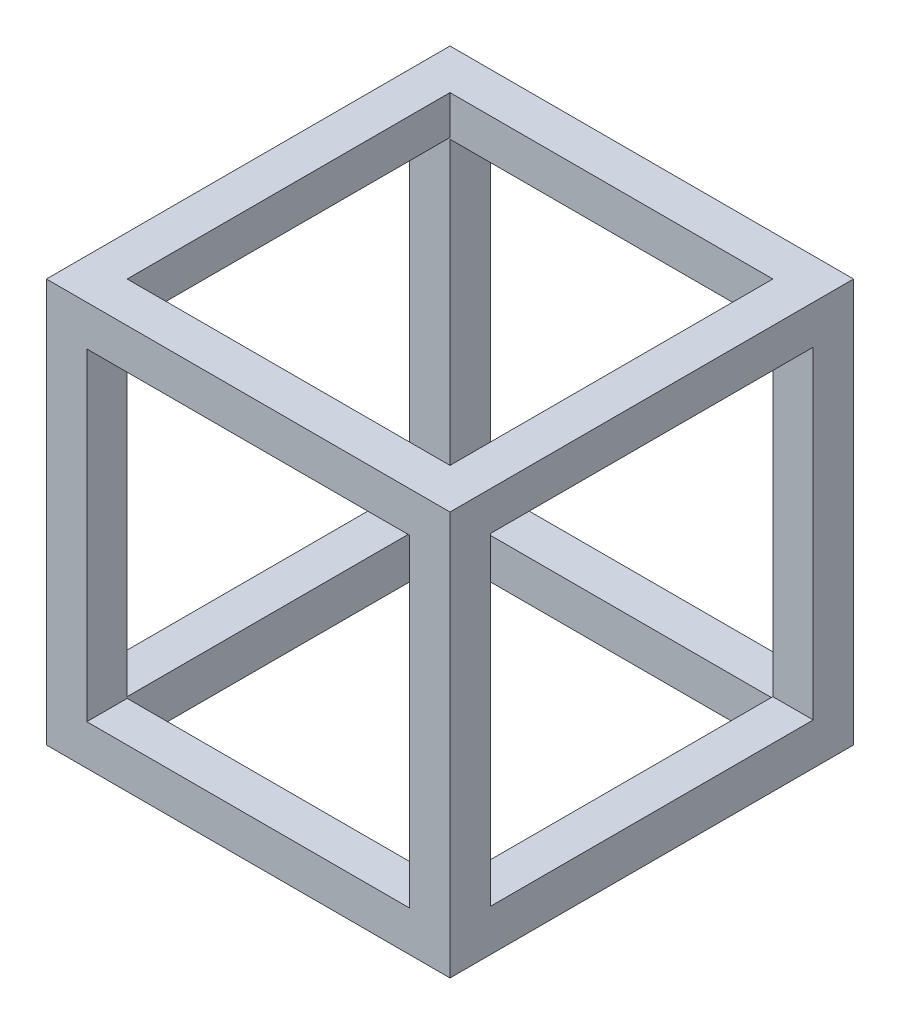
ISO-10303-21;
HEADER;
FILE_DESCRIPTION(('STEP AP214'),'2;1');
FILE_NAME('part.step','',(''),(''),'','','');
FILE_SCHEMA(('AUTOMOTIVE_DESIGN { 1 0 10303 214 1 1 1 1 }'));
ENDSEC;
DATA;
#1=APPLICATION_CONTEXT('core data for automotive mechanical design processes');
#2=APPLICATION_PROTOCOL_DEFINITION('international standard','automotive_design',2000,#1);
#3=PRODUCT_CONTEXT('',#1,'mechanical');
#4=PRODUCT('Part','Part','',(#3));
#5=PRODUCT_RELATED_PRODUCT_CATEGORY('part','',(#4));
#6=PRODUCT_DEFINITION_FORMATION('','',#4);
#7=PRODUCT_DEFINITION_CONTEXT('part definition',#1,'design');
#8=PRODUCT_DEFINITION('design','',#6,#7);
#9=PRODUCT_DEFINITION_SHAPE('','',#8);
#10=(LENGTH_UNIT() NAMED_UNIT(*) SI_UNIT(.MILLI.,.METRE.));
#11=(NAMED_UNIT(*) PLANE_ANGLE_UNIT() SI_UNIT($,.RADIAN.));
#12=(NAMED_UNIT(*) SI_UNIT($,.STERADIAN.) SOLID_ANGLE_UNIT());
#13=UNCERTAINTY_MEASURE_WITH_UNIT(LENGTH_MEASURE(1.E-05),#10,'distance_accuracy_value','');
#14=(GEOMETRIC_REPRESENTATION_CONTEXT(3) GLOBAL_UNCERTAINTY_ASSIGNED_CONTEXT((#13)) GLOBAL_UNIT_ASSIGNED_CONTEXT((#10,
#11,#12)) REPRESENTATION_CONTEXT('',''));
#15=CARTESIAN_POINT('',(0.,0.,0.));
#16=DIRECTION('',(0.,0.,1.));
#17=DIRECTION('',(1.,0.,0.));
#18=AXIS2_PLACEMENT_3D('',#15,#16,#17);
#19=CARTESIAN_POINT('',(-0.5,0.903735104643965,0.4));
#20=DIRECTION('',(0.,1.,0.));
#21=DIRECTION('',(0.,0.,1.));
#22=AXIS2_PLACEMENT_3D('',#19,#20,#21);
#23=PLANE('',#22);
#24=DIRECTION('',(1.,0.,0.));
#25=VECTOR('',#24,1.);
#26=CARTESIAN_POINT('',(-0.5,0.903735104643965,0.4));
#27=LINE('',#26,#25);
#28=CARTESIAN_POINT('',(0.4,0.903735104643965,0.4));
#29=VERTEX_POINT('',#28);
#30=CARTESIAN_POINT('',(0.5,0.903735104643965,0.4));
#31=VERTEX_POINT('',#30);
#32=EDGE_CURVE('E384',#29,#31,#27,.T.);
#33=ORIENTED_EDGE('',*,*,#32,.F.);
#34=DIRECTION('',(0.,0.,-1.));
#35=VECTOR('',#34,1.);
#36=CARTESIAN_POINT('',(0.4,0.903735104643965,0.4));
#37=LINE('',#36,#35);
#38=CARTESIAN_POINT('',(0.4,0.903735104643965,-0.4));
#39=VERTEX_POINT('',#38);
#40=EDGE_CURVE('E263',#29,#39,#37,.T.);
#41=ORIENTED_EDGE('',*,*,#40,.T.);
#42=DIRECTION('',(1.,0.,0.));
#43=VECTOR('',#42,1.);
#44=CARTESIAN_POINT('',(-0.5,0.903735104643965,-0.4));
#45=LINE('',#44,#43);
#46=CARTESIAN_POINT('',(0.5,0.903735104643965,-0.4));
#47=VERTEX_POINT('',#46);
#48=EDGE_CURVE('E354',#39,#47,#45,.T.);
#49=ORIENTED_EDGE('',*,*,#48,.T.);
#50=DIRECTION('',(0.,0.,1.));
#51=VECTOR('',#50,1.);
#52=CARTESIAN_POINT('',(0.5,0.903735104643965,0.4));
#53=LINE('',#52,#51);
#54=EDGE_CURVE('E358',#47,#31,#53,.T.);
#55=ORIENTED_EDGE('',*,*,#54,.T.);
#56=EDGE_LOOP('',(#33,#41,#49,#55));
#57=FACE_BOUND('',#56,.T.);
#58=ADVANCED_FACE('F39',(#57),#23,.F.);
#59=CARTESIAN_POINT('',(-0.4,0.1,-0.5));
#60=DIRECTION('',(0.,-1.,0.));
#61=DIRECTION('',(0.,0.,-1.));
#62=AXIS2_PLACEMENT_3D('',#59,#60,#61);
#63=PLANE('',#62);
#64=DIRECTION('',(0.,0.,1.));
#65=VECTOR('',#64,1.);
#66=CARTESIAN_POINT('',(0.4,0.1,-0.5));
#67=LINE('',#66,#65);
#68=CARTESIAN_POINT('',(0.4,0.1,0.4));
#69=VERTEX_POINT('',#68);
#70=CARTESIAN_POINT('',(0.4,0.1,0.5));
#71=VERTEX_POINT('',#70);
#72=EDGE_CURVE('E302',#69,#71,#67,.T.);
#73=ORIENTED_EDGE('',*,*,#72,.F.);
#74=DIRECTION('',(-1.,0.,0.));
#75=VECTOR('',#74,1.);
#76=CARTESIAN_POINT('',(-0.4,0.1,0.4));
#77=LINE('',#76,#75);
#78=CARTESIAN_POINT('',(-0.4,0.1,0.4));
#79=VERTEX_POINT('',#78);
#80=EDGE_CURVE('E11',#69,#79,#77,.T.);
#81=ORIENTED_EDGE('',*,*,#80,.T.);
#82=DIRECTION('',(0.,0.,1.));
#83=VECTOR('',#82,1.);
#84=CARTESIAN_POINT('',(-0.4,0.1,-0.5));
#85=LINE('',#84,#83);
#86=CARTESIAN_POINT('',(-0.4,0.1,0.5));
#87=VERTEX_POINT('',#86);
#88=EDGE_CURVE('E307',#79,#87,#85,.T.);
#89=ORIENTED_EDGE('',*,*,#88,.T.);
#90=DIRECTION('',(1.,0.,0.));
#91=VECTOR('',#90,1.);
#92=CARTESIAN_POINT('',(-0.4,0.1,0.5));
#93=LINE('',#92,#91);
#94=EDGE_CURVE('E273',#87,#71,#93,.T.);
#95=ORIENTED_EDGE('',*,*,#94,.T.);
#96=EDGE_LOOP('',(#73,#81,#89,#95));
#97=FACE_BOUND('',#96,.T.);
#98=ADVANCED_FACE('F511',(#97),#63,.F.);
#99=CARTESIAN_POINT('',(-0.5,0.103735104643965,0.4));
#100=DIRECTION('',(0.,-1.,0.));
#101=DIRECTION('',(0.,0.,-1.));
#102=AXIS2_PLACEMENT_3D('',#99,#100,#101);
#103=PLANE('',#102);
#104=DIRECTION('',(1.,0.,0.));
#105=VECTOR('',#104,1.);
#106=CARTESIAN_POINT('',(-0.5,0.103735104643965,-0.4));
#107=LINE('',#106,#105);
#108=CARTESIAN_POINT('',(0.4,0.103735104643965,-0.4));
#109=VERTEX_POINT('',#108);
#110=CARTESIAN_POINT('',(0.5,0.103735104643965,-0.4));
#111=VERTEX_POINT('',#110);
#112=EDGE_CURVE('E374',#109,#111,#107,.T.);
#113=ORIENTED_EDGE('',*,*,#112,.F.);
#114=DIRECTION('',(0.,0.,1.));
#115=VECTOR('',#114,1.);
#116=CARTESIAN_POINT('',(0.4,0.103735104643965,0.4));
#117=LINE('',#116,#115);
#118=CARTESIAN_POINT('',(0.4,0.103735104643965,0.4));
#119=VERTEX_POINT('',#118);
#120=EDGE_CURVE('E328',#109,#119,#117,.T.);
#121=ORIENTED_EDGE('',*,*,#120,.T.);
#122=DIRECTION('',(1.,0.,0.));
#123=VECTOR('',#122,1.);
#124=CARTESIAN_POINT('',(-0.5,0.103735104643965,0.4));
#125=LINE('',#124,#123);
#126=CARTESIAN_POINT('',(0.5,0.103735104643965,0.4));
#127=VERTEX_POINT('',#126);
#128=EDGE_CURVE('E379',#119,#127,#125,.T.);
#129=ORIENTED_EDGE('',*,*,#128,.T.);
#130=DIRECTION('',(0.,0.,-1.));
#131=VECTOR('',#130,1.);
#132=CARTESIAN_POINT('',(0.5,0.103735104643965,0.4));
#133=LINE('',#132,#131);
#134=EDGE_CURVE('E342',#127,#111,#133,.T.);
#135=ORIENTED_EDGE('',*,*,#134,.T.);
#136=EDGE_LOOP('',(#113,#121,#129,#135));
#137=FACE_BOUND('',#136,.T.);
#138=ADVANCED_FACE('F529',(#137),#103,.F.);
#139=CARTESIAN_POINT('',(-0.5,1.,0.5));
#140=DIRECTION('',(0.,0.,-1.));
#141=DIRECTION('',(-1.,0.,0.));
#142=AXIS2_PLACEMENT_3D('',#139,#140,#141);
#143=PLANE('',#142);
#144=DIRECTION('',(-1.,0.,0.));
#145=VECTOR('',#144,1.);
#146=CARTESIAN_POINT('',(-0.4,0.9,0.5));
#147=LINE('',#146,#145);
#148=CARTESIAN_POINT('',(0.4,0.9,0.5));
#149=VERTEX_POINT('',#148);
#150=CARTESIAN_POINT('',(-0.4,0.9,0.5));
#151=VERTEX_POINT('',#150);
#152=EDGE_CURVE('E288',#149,#151,#147,.T.);
#153=ORIENTED_EDGE('',*,*,#152,.F.);
#154=DIRECTION('',(0.,1.,0.));
#155=VECTOR('',#154,1.);
#156=CARTESIAN_POINT('',(0.4,0.1,0.5));
#157=LINE('',#156,#155);
#158=EDGE_CURVE('E267',#71,#149,#157,.T.);
#159=ORIENTED_EDGE('',*,*,#158,.F.);
#160=ORIENTED_EDGE('',*,*,#94,.F.);
#161=DIRECTION('',(0.,-1.,0.));
#162=VECTOR('',#161,1.);
#163=CARTESIAN_POINT('',(-0.4,0.1,0.5));
#164=LINE('',#163,#162);
#165=EDGE_CURVE('E292',#151,#87,#164,.T.);
#166=ORIENTED_EDGE('',*,*,#165,.F.);
#167=EDGE_LOOP('',(#153,#159,#160,#166));
#168=FACE_BOUND('',#167,.T.);
#169=DIRECTION('',(1.,0.,0.));
#170=VECTOR('',#169,1.);
#171=CARTESIAN_POINT('',(-0.5,0.,0.5));
#172=LINE('',#171,#170);
#173=CARTESIAN_POINT('',(-0.5,0.,0.5));
#174=VERTEX_POINT('',#173);
#175=CARTESIAN_POINT('',(0.5,0.,0.5));
#176=VERTEX_POINT('',#175);
#177=EDGE_CURVE('E373',#174,#176,#172,.T.);
#178=ORIENTED_EDGE('',*,*,#177,.T.);
#179=DIRECTION('',(0.,-1.,0.));
#180=VECTOR('',#179,1.);
#181=CARTESIAN_POINT('',(0.5,1.,0.5));
#182=LINE('',#181,#180);
#183=CARTESIAN_POINT('',(0.5,1.,0.5));
#184=VERTEX_POINT('',#183);
#185=EDGE_CURVE('E428',#184,#176,#182,.T.);
#186=ORIENTED_EDGE('',*,*,#185,.F.);
#187=DIRECTION('',(1.,0.,0.));
#188=VECTOR('',#187,1.);
#189=CARTESIAN_POINT('',(-0.5,1.,0.5));
#190=LINE('',#189,#188);
#191=CARTESIAN_POINT('',(-0.5,1.,0.5));
#192=VERTEX_POINT('',#191);
#193=EDGE_CURVE('E389',#192,#184,#190,.T.);
#194=ORIENTED_EDGE('',*,*,#193,.F.);
#195=DIRECTION('',(0.,-1.,0.));
#196=VECTOR('',#195,1.);
#197=CARTESIAN_POINT('',(-0.5,1.,0.5));
#198=LINE('',#197,#196);
#199=EDGE_CURVE('E405',#192,#174,#198,.T.);
#200=ORIENTED_EDGE('',*,*,#199,.T.);
#201=EDGE_LOOP('',(#178,#186,#194,#200));
#202=FACE_BOUND('',#201,.T.);
#203=ADVANCED_FACE('F41',(#168,#202),#143,.F.);
#204=CARTESIAN_POINT('',(0.5,1.,0.5));
#205=DIRECTION('',(-1.,0.,0.));
#206=DIRECTION('',(0.,0.,1.));
#207=AXIS2_PLACEMENT_3D('',#204,#205,#206);
#208=PLANE('',#207);
#209=ORIENTED_EDGE('',*,*,#54,.F.);
#210=DIRECTION('',(0.,1.,0.));
#211=VECTOR('',#210,1.);
#212=CARTESIAN_POINT('',(0.5,0.103735104643965,-0.4));
#213=LINE('',#212,#211);
#214=EDGE_CURVE('E336',#111,#47,#213,.T.);
#215=ORIENTED_EDGE('',*,*,#214,.F.);
#216=ORIENTED_EDGE('',*,*,#134,.F.);
#217=DIRECTION('',(0.,-1.,0.));
#218=VECTOR('',#217,1.);
#219=CARTESIAN_POINT('',(0.5,0.103735104643965,0.4));
#220=LINE('',#219,#218);
#221=EDGE_CURVE('E362',#31,#127,#220,.T.);
#222=ORIENTED_EDGE('',*,*,#221,.F.);
#223=EDGE_LOOP('',(#209,#215,#216,#222));
#224=FACE_BOUND('',#223,.T.);
#225=DIRECTION('',(0.,0.,-1.));
#226=VECTOR('',#225,1.);
#227=CARTESIAN_POINT('',(0.5,0.,0.5));
#228=LINE('',#227,#226);
#229=CARTESIAN_POINT('',(0.5,0.,-0.5));
#230=VERTEX_POINT('',#229);
#231=EDGE_CURVE('E409',#176,#230,#228,.T.);
#232=ORIENTED_EDGE('',*,*,#231,.T.);
#233=DIRECTION('',(0.,-1.,0.));
#234=VECTOR('',#233,1.);
#235=CARTESIAN_POINT('',(0.5,1.,-0.5));
#236=LINE('',#235,#234);
#237=CARTESIAN_POINT('',(0.5,1.,-0.5));
#238=VERTEX_POINT('',#237);
#239=EDGE_CURVE('E425',#238,#230,#236,.T.);
#240=ORIENTED_EDGE('',*,*,#239,.F.);
#241=DIRECTION('',(0.,0.,-1.));
#242=VECTOR('',#241,1.);
#243=CARTESIAN_POINT('',(0.5,1.,0.5));
#244=LINE('',#243,#242);
#245=EDGE_CURVE('E393',#184,#238,#244,.T.);
#246=ORIENTED_EDGE('',*,*,#245,.F.);
#247=ORIENTED_EDGE('',*,*,#185,.T.);
#248=EDGE_LOOP('',(#232,#240,#246,#247));
#249=FACE_BOUND('',#248,.T.);
#250=ADVANCED_FACE('F660',(#224,#249),#208,.F.);
#251=CARTESIAN_POINT('',(-0.5,1.,-0.5));
#252=DIRECTION('',(0.,0.,-1.));
#253=DIRECTION('',(-1.,0.,0.));
#254=AXIS2_PLACEMENT_3D('',#251,#252,#253);
#255=PLANE('',#254);
#256=DIRECTION('',(0.,1.,0.));
#257=VECTOR('',#256,1.);
#258=CARTESIAN_POINT('',(0.4,0.1,-0.5));
#259=LINE('',#258,#257);
#260=CARTESIAN_POINT('',(0.4,0.1,-0.5));
#261=VERTEX_POINT('',#260);
#262=CARTESIAN_POINT('',(0.4,0.9,-0.5));
#263=VERTEX_POINT('',#262);
#264=EDGE_CURVE('E268',#261,#263,#259,.T.);
#265=ORIENTED_EDGE('',*,*,#264,.T.);
#266=DIRECTION('',(-1.,0.,0.));
#267=VECTOR('',#266,1.);
#268=CARTESIAN_POINT('',(-0.4,0.9,-0.5));
#269=LINE('',#268,#267);
#270=CARTESIAN_POINT('',(-0.4,0.9,-0.5));
#271=VERTEX_POINT('',#270);
#272=EDGE_CURVE('E272',#263,#271,#269,.T.);
#273=ORIENTED_EDGE('',*,*,#272,.T.);
#274=DIRECTION('',(0.,-1.,0.));
#275=VECTOR('',#274,1.);
#276=CARTESIAN_POINT('',(-0.4,0.1,-0.5));
#277=LINE('',#276,#275);
#278=CARTESIAN_POINT('',(-0.4,0.1,-0.5));
#279=VERTEX_POINT('',#278);
#280=EDGE_CURVE('E277',#271,#279,#277,.T.);
#281=ORIENTED_EDGE('',*,*,#280,.T.);
#282=DIRECTION('',(1.,0.,0.));
#283=VECTOR('',#282,1.);
#284=CARTESIAN_POINT('',(-0.4,0.1,-0.5));
#285=LINE('',#284,#283);
#286=EDGE_CURVE('E281',#279,#261,#285,.T.);
#287=ORIENTED_EDGE('',*,*,#286,.T.);
#288=EDGE_LOOP('',(#265,#273,#281,#287));
#289=FACE_BOUND('',#288,.T.);
#290=DIRECTION('',(1.,0.,0.));
#291=VECTOR('',#290,1.);
#292=CARTESIAN_POINT('',(-0.5,0.,-0.5));
#293=LINE('',#292,#291);
#294=CARTESIAN_POINT('',(-0.5,0.,-0.5));
#295=VERTEX_POINT('',#294);
#296=EDGE_CURVE('E413',#295,#230,#293,.T.);
#297=ORIENTED_EDGE('',*,*,#296,.F.);
#298=DIRECTION('',(0.,-1.,0.));
#299=VECTOR('',#298,1.);
#300=CARTESIAN_POINT('',(-0.5,1.,-0.5));
#301=LINE('',#300,#299);
#302=CARTESIAN_POINT('',(-0.5,1.,-0.5));
#303=VERTEX_POINT('',#302);
#304=EDGE_CURVE('E422',#303,#295,#301,.T.);
#305=ORIENTED_EDGE('',*,*,#304,.F.);
#306=DIRECTION('',(1.,0.,0.));
#307=VECTOR('',#306,1.);
#308=CARTESIAN_POINT('',(-0.5,1.,-0.5));
#309=LINE('',#308,#307);
#310=EDGE_CURVE('E397',#303,#238,#309,.T.);
#311=ORIENTED_EDGE('',*,*,#310,.T.);
#312=ORIENTED_EDGE('',*,*,#239,.T.);
#313=EDGE_LOOP('',(#297,#305,#311,#312));
#314=FACE_BOUND('',#313,.T.);
#315=ADVANCED_FACE('F450',(#289,#314),#255,.T.);
#316=CARTESIAN_POINT('',(-0.5,1.,0.5));
#317=DIRECTION('',(-1.,0.,0.));
#318=DIRECTION('',(0.,0.,1.));
#319=AXIS2_PLACEMENT_3D('',#316,#317,#318);
#320=PLANE('',#319);
#321=DIRECTION('',(0.,1.,0.));
#322=VECTOR('',#321,1.);
#323=CARTESIAN_POINT('',(-0.5,0.103735104643965,-0.4));
#324=LINE('',#323,#322);
#325=CARTESIAN_POINT('',(-0.5,0.103735104643965,-0.4));
#326=VERTEX_POINT('',#325);
#327=CARTESIAN_POINT('',(-0.5,0.903735104643965,-0.4));
#328=VERTEX_POINT('',#327);
#329=EDGE_CURVE('E337',#326,#328,#324,.T.);
#330=ORIENTED_EDGE('',*,*,#329,.T.);
#331=DIRECTION('',(0.,0.,1.));
#332=VECTOR('',#331,1.);
#333=CARTESIAN_POINT('',(-0.5,0.903735104643965,0.4));
#334=LINE('',#333,#332);
#335=CARTESIAN_POINT('',(-0.5,0.903735104643965,0.4));
#336=VERTEX_POINT('',#335);
#337=EDGE_CURVE('E341',#328,#336,#334,.T.);
#338=ORIENTED_EDGE('',*,*,#337,.T.);
#339=DIRECTION('',(0.,-1.,0.));
#340=VECTOR('',#339,1.);
#341=CARTESIAN_POINT('',(-0.5,0.103735104643965,0.4));
#342=LINE('',#341,#340);
#343=CARTESIAN_POINT('',(-0.5,0.103735104643965,0.4));
#344=VERTEX_POINT('',#343);
#345=EDGE_CURVE('E346',#336,#344,#342,.T.);
#346=ORIENTED_EDGE('',*,*,#345,.T.);
#347=DIRECTION('',(0.,0.,-1.));
#348=VECTOR('',#347,1.);
#349=CARTESIAN_POINT('',(-0.5,0.103735104643965,0.4));
#350=LINE('',#349,#348);
#351=EDGE_CURVE('E350',#344,#326,#350,.T.);
#352=ORIENTED_EDGE('',*,*,#351,.T.);
#353=EDGE_LOOP('',(#330,#338,#346,#352));
#354=FACE_BOUND('',#353,.T.);
#355=DIRECTION('',(0.,0.,-1.));
#356=VECTOR('',#355,1.);
#357=CARTESIAN_POINT('',(-0.5,0.,0.5));
#358=LINE('',#357,#356);
#359=EDGE_CURVE('E394',#174,#295,#358,.T.);
#360=ORIENTED_EDGE('',*,*,#359,.F.);
#361=ORIENTED_EDGE('',*,*,#199,.F.);
#362=DIRECTION('',(0.,0.,-1.));
#363=VECTOR('',#362,1.);
#364=CARTESIAN_POINT('',(-0.5,1.,0.5));
#365=LINE('',#364,#363);
#366=EDGE_CURVE('E401',#192,#303,#365,.T.);
#367=ORIENTED_EDGE('',*,*,#366,.T.);
#368=ORIENTED_EDGE('',*,*,#304,.T.);
#369=EDGE_LOOP('',(#360,#361,#367,#368));
#370=FACE_BOUND('',#369,.T.);
#371=ADVANCED_FACE('F492',(#354,#370),#320,.T.);
#372=CARTESIAN_POINT('',(0.,1.,0.));
#373=DIRECTION('',(0.,1.,0.));
#374=DIRECTION('',(0.,0.,1.));
#375=AXIS2_PLACEMENT_3D('',#372,#373,#374);
#376=PLANE('',#375);
#377=DIRECTION('',(0.,0.,-1.));
#378=VECTOR('',#377,1.);
#379=CARTESIAN_POINT('',(0.4,1.,0.4));
#380=LINE('',#379,#378);
#381=CARTESIAN_POINT('',(0.4,1.,0.4));
#382=VERTEX_POINT('',#381);
#383=CARTESIAN_POINT('',(0.4,1.,-0.4));
#384=VERTEX_POINT('',#383);
#385=EDGE_CURVE('E55',#382,#384,#380,.T.);
#386=ORIENTED_EDGE('',*,*,#385,.F.);
#387=DIRECTION('',(1.,0.,0.));
#388=VECTOR('',#387,1.);
#389=CARTESIAN_POINT('',(-0.4,1.,0.4));
#390=LINE('',#389,#388);
#391=CARTESIAN_POINT('',(-0.4,1.,0.4));
#392=VERTEX_POINT('',#391);
#393=EDGE_CURVE('E229',#392,#382,#390,.T.);
#394=ORIENTED_EDGE('',*,*,#393,.F.);
#395=DIRECTION('',(0.,0.,1.));
#396=VECTOR('',#395,1.);
#397=CARTESIAN_POINT('',(-0.4,1.,0.4));
#398=LINE('',#397,#396);
#399=CARTESIAN_POINT('',(-0.4,1.,-0.4));
#400=VERTEX_POINT('',#399);
#401=EDGE_CURVE('E233',#400,#392,#398,.T.);
#402=ORIENTED_EDGE('',*,*,#401,.F.);
#403=DIRECTION('',(-1.,0.,0.));
#404=VECTOR('',#403,1.);
#405=CARTESIAN_POINT('',(-0.4,1.,-0.4));
#406=LINE('',#405,#404);
#407=EDGE_CURVE('E242',#384,#400,#406,.T.);
#408=ORIENTED_EDGE('',*,*,#407,.F.);
#409=EDGE_LOOP('',(#386,#394,#402,#408));
#410=FACE_BOUND('',#409,.T.);
#411=ORIENTED_EDGE('',*,*,#193,.T.);
#412=ORIENTED_EDGE('',*,*,#245,.T.);
#413=ORIENTED_EDGE('',*,*,#310,.F.);
#414=ORIENTED_EDGE('',*,*,#366,.F.);
#415=EDGE_LOOP('',(#411,#412,#413,#414));
#416=FACE_BOUND('',#415,.T.);
#417=ADVANCED_FACE('F481',(#410,#416),#376,.T.);
#418=CARTESIAN_POINT('',(0.,0.,0.));
#419=DIRECTION('',(0.,1.,0.));
#420=DIRECTION('',(0.,0.,1.));
#421=AXIS2_PLACEMENT_3D('',#418,#419,#420);
#422=PLANE('',#421);
#423=DIRECTION('',(1.,0.,0.));
#424=VECTOR('',#423,1.);
#425=CARTESIAN_POINT('',(-0.4,0.,0.4));
#426=LINE('',#425,#424);
#427=CARTESIAN_POINT('',(-0.4,0.,0.4));
#428=VERTEX_POINT('',#427);
#429=CARTESIAN_POINT('',(0.4,0.,0.4));
#430=VERTEX_POINT('',#429);
#431=EDGE_CURVE('E227',#428,#430,#426,.T.);
#432=ORIENTED_EDGE('',*,*,#431,.T.);
#433=DIRECTION('',(0.,0.,-1.));
#434=VECTOR('',#433,1.);
#435=CARTESIAN_POINT('',(0.4,0.,0.4));
#436=LINE('',#435,#434);
#437=CARTESIAN_POINT('',(0.4,0.,-0.4));
#438=VERTEX_POINT('',#437);
#439=EDGE_CURVE('E207',#430,#438,#436,.T.);
#440=ORIENTED_EDGE('',*,*,#439,.T.);
#441=DIRECTION('',(-1.,0.,0.));
#442=VECTOR('',#441,1.);
#443=CARTESIAN_POINT('',(-0.4,0.,-0.4));
#444=LINE('',#443,#442);
#445=CARTESIAN_POINT('',(-0.4,0.,-0.4));
#446=VERTEX_POINT('',#445);
#447=EDGE_CURVE('E218',#438,#446,#444,.T.);
#448=ORIENTED_EDGE('',*,*,#447,.T.);
#449=DIRECTION('',(0.,0.,1.));
#450=VECTOR('',#449,1.);
#451=CARTESIAN_POINT('',(-0.4,0.,0.4));
#452=LINE('',#451,#450);
#453=EDGE_CURVE('E63',#446,#428,#452,.T.);
#454=ORIENTED_EDGE('',*,*,#453,.T.);
#455=EDGE_LOOP('',(#432,#440,#448,#454));
#456=FACE_BOUND('',#455,.T.);
#457=ORIENTED_EDGE('',*,*,#177,.F.);
#458=ORIENTED_EDGE('',*,*,#359,.T.);
#459=ORIENTED_EDGE('',*,*,#296,.T.);
#460=ORIENTED_EDGE('',*,*,#231,.F.);
#461=EDGE_LOOP('',(#457,#458,#459,#460));
#462=FACE_BOUND('',#461,.T.);
#463=ADVANCED_FACE('F224',(#456,#462),#422,.F.);
#464=CARTESIAN_POINT('',(-0.5,0.103735104643965,-0.4));
#465=DIRECTION('',(0.,0.,-1.));
#466=DIRECTION('',(0.,1.,0.));
#467=AXIS2_PLACEMENT_3D('',#464,#465,#466);
#468=PLANE('',#467);
#469=DIRECTION('',(0.,1.,0.));
#470=VECTOR('',#469,1.);
#471=CARTESIAN_POINT('',(-0.4,0.103735104643965,-0.4));
#472=LINE('',#471,#470);
#473=CARTESIAN_POINT('',(-0.4,0.103735104643965,-0.4));
#474=VERTEX_POINT('',#473);
#475=CARTESIAN_POINT('',(-0.4,0.9,-0.4));
#476=VERTEX_POINT('',#475);
#477=EDGE_CURVE('E324',#474,#476,#472,.T.);
#478=ORIENTED_EDGE('',*,*,#477,.T.);
#479=DIRECTION('',(1.,0.,0.));
#480=VECTOR('',#479,1.);
#481=CARTESIAN_POINT('',(-0.5,0.9,-0.4));
#482=LINE('',#481,#480);
#483=CARTESIAN_POINT('',(0.4,0.9,-0.4));
#484=VERTEX_POINT('',#483);
#485=EDGE_CURVE('E301',#476,#484,#482,.T.);
#486=ORIENTED_EDGE('',*,*,#485,.T.);
#487=DIRECTION('',(0.,-1.,0.));
#488=VECTOR('',#487,1.);
#489=CARTESIAN_POINT('',(0.4,0.103735104643966,-0.4));
#490=LINE('',#489,#488);
#491=EDGE_CURVE('E332',#484,#109,#490,.T.);
#492=ORIENTED_EDGE('',*,*,#491,.T.);
#493=ORIENTED_EDGE('',*,*,#112,.T.);
#494=ORIENTED_EDGE('',*,*,#214,.T.);
#495=ORIENTED_EDGE('',*,*,#48,.F.);
#496=DIRECTION('',(0.,1.,0.));
#497=VECTOR('',#496,1.);
#498=CARTESIAN_POINT('',(0.4,0.,-0.4));
#499=LINE('',#498,#497);
#500=EDGE_CURVE('E215',#39,#384,#499,.T.);
#501=ORIENTED_EDGE('',*,*,#500,.T.);
#502=ORIENTED_EDGE('',*,*,#407,.T.);
#503=DIRECTION('',(0.,1.,0.));
#504=VECTOR('',#503,1.);
#505=CARTESIAN_POINT('',(-0.4,0.,-0.4));
#506=LINE('',#505,#504);
#507=CARTESIAN_POINT('',(-0.4,0.903735104643965,-0.4));
#508=VERTEX_POINT('',#507);
#509=EDGE_CURVE('E214',#508,#400,#506,.T.);
#510=ORIENTED_EDGE('',*,*,#509,.F.);
#511=EDGE_CURVE('E385',#328,#508,#45,.T.);
#512=ORIENTED_EDGE('',*,*,#511,.F.);
#513=ORIENTED_EDGE('',*,*,#329,.F.);
#514=EDGE_CURVE('E369',#326,#474,#107,.T.);
#515=ORIENTED_EDGE('',*,*,#514,.T.);
#516=EDGE_LOOP('',(#478,#486,#492,#493,#494,#495,#501,#502,#510,#512,#513,#515));
#517=FACE_BOUND('',#516,.T.);
#518=ADVANCED_FACE('F456',(#517),#468,.F.);
#519=CARTESIAN_POINT('',(-0.4,0.103735104643965,0.4));
#520=VERTEX_POINT('',#519);
#521=EDGE_CURVE('E375',#344,#520,#125,.T.);
#522=ORIENTED_EDGE('',*,*,#521,.T.);
#523=DIRECTION('',(0.,0.,-1.));
#524=VECTOR('',#523,1.);
#525=CARTESIAN_POINT('',(-0.4,0.103735104643965,0.4));
#526=LINE('',#525,#524);
#527=EDGE_CURVE('E320',#520,#474,#526,.T.);
#528=ORIENTED_EDGE('',*,*,#527,.T.);
#529=ORIENTED_EDGE('',*,*,#514,.F.);
#530=ORIENTED_EDGE('',*,*,#351,.F.);
#531=EDGE_LOOP('',(#522,#528,#529,#530));
#532=FACE_BOUND('',#531,.T.);
#533=ADVANCED_FACE('F460',(#532),#103,.F.);
#534=CARTESIAN_POINT('',(-0.5,0.103735104643965,0.4));
#535=DIRECTION('',(0.,0.,1.));
#536=DIRECTION('',(0.,-1.,0.));
#537=AXIS2_PLACEMENT_3D('',#534,#535,#536);
#538=PLANE('',#537);
#539=CARTESIAN_POINT('',(-0.4,0.903735104643965,0.4));
#540=VERTEX_POINT('',#539);
#541=EDGE_CURVE('E380',#336,#540,#27,.T.);
#542=ORIENTED_EDGE('',*,*,#541,.T.);
#543=DIRECTION('',(0.,1.,0.));
#544=VECTOR('',#543,1.);
#545=CARTESIAN_POINT('',(-0.4,0.,0.4));
#546=LINE('',#545,#544);
#547=EDGE_CURVE('E257',#540,#392,#546,.T.);
#548=ORIENTED_EDGE('',*,*,#547,.T.);
#549=ORIENTED_EDGE('',*,*,#393,.T.);
#550=DIRECTION('',(0.,1.,0.));
#551=VECTOR('',#550,1.);
#552=CARTESIAN_POINT('',(0.4,0.,0.4));
#553=LINE('',#552,#551);
#554=EDGE_CURVE('E253',#29,#382,#553,.T.);
#555=ORIENTED_EDGE('',*,*,#554,.F.);
#556=ORIENTED_EDGE('',*,*,#32,.T.);
#557=ORIENTED_EDGE('',*,*,#221,.T.);
#558=ORIENTED_EDGE('',*,*,#128,.F.);
#559=DIRECTION('',(0.,1.,0.));
#560=VECTOR('',#559,1.);
#561=CARTESIAN_POINT('',(0.4,0.103735104643966,0.4));
#562=LINE('',#561,#560);
#563=CARTESIAN_POINT('',(0.4,0.9,0.4));
#564=VERTEX_POINT('',#563);
#565=EDGE_CURVE('E440',#119,#564,#562,.T.);
#566=ORIENTED_EDGE('',*,*,#565,.T.);
#567=DIRECTION('',(-1.,0.,0.));
#568=VECTOR('',#567,1.);
#569=CARTESIAN_POINT('',(-0.5,0.9,0.4));
#570=LINE('',#569,#568);
#571=CARTESIAN_POINT('',(-0.4,0.9,0.4));
#572=VERTEX_POINT('',#571);
#573=EDGE_CURVE('E432',#564,#572,#570,.T.);
#574=ORIENTED_EDGE('',*,*,#573,.T.);
#575=DIRECTION('',(0.,-1.,0.));
#576=VECTOR('',#575,1.);
#577=CARTESIAN_POINT('',(-0.4,0.103735104643965,0.4));
#578=LINE('',#577,#576);
#579=EDGE_CURVE('E436',#572,#520,#578,.T.);
#580=ORIENTED_EDGE('',*,*,#579,.T.);
#581=ORIENTED_EDGE('',*,*,#521,.F.);
#582=ORIENTED_EDGE('',*,*,#345,.F.);
#583=EDGE_LOOP('',(#542,#548,#549,#555,#556,#557,#558,#566,#574,#580,#581,#582));
#584=FACE_BOUND('',#583,.T.);
#585=ADVANCED_FACE('F463',(#584),#538,.F.);
#586=ORIENTED_EDGE('',*,*,#511,.T.);
#587=DIRECTION('',(0.,0.,1.));
#588=VECTOR('',#587,1.);
#589=CARTESIAN_POINT('',(-0.4,0.903735104643965,0.4));
#590=LINE('',#589,#588);
#591=EDGE_CURVE('E252',#508,#540,#590,.T.);
#592=ORIENTED_EDGE('',*,*,#591,.T.);
#593=ORIENTED_EDGE('',*,*,#541,.F.);
#594=ORIENTED_EDGE('',*,*,#337,.F.);
#595=EDGE_LOOP('',(#586,#592,#593,#594));
#596=FACE_BOUND('',#595,.T.);
#597=ADVANCED_FACE('F490',(#596),#23,.F.);
#598=CARTESIAN_POINT('',(0.4,0.1,-0.5));
#599=DIRECTION('',(1.,0.,0.));
#600=DIRECTION('',(0.,1.,0.));
#601=AXIS2_PLACEMENT_3D('',#598,#599,#600);
#602=PLANE('',#601);
#603=CARTESIAN_POINT('',(0.4,0.1,-0.4));
#604=VERTEX_POINT('',#603);
#605=EDGE_CURVE('E210',#261,#604,#67,.T.);
#606=ORIENTED_EDGE('',*,*,#605,.T.);
#607=EDGE_CURVE('E202',#438,#604,#499,.T.);
#608=ORIENTED_EDGE('',*,*,#607,.F.);
#609=ORIENTED_EDGE('',*,*,#439,.F.);
#610=EDGE_CURVE('E249',#430,#69,#553,.T.);
#611=ORIENTED_EDGE('',*,*,#610,.T.);
#612=ORIENTED_EDGE('',*,*,#72,.T.);
#613=ORIENTED_EDGE('',*,*,#158,.T.);
#614=DIRECTION('',(0.,0.,1.));
#615=VECTOR('',#614,1.);
#616=CARTESIAN_POINT('',(0.4,0.9,-0.5));
#617=LINE('',#616,#615);
#618=EDGE_CURVE('E285',#564,#149,#617,.T.);
#619=ORIENTED_EDGE('',*,*,#618,.F.);
#620=ORIENTED_EDGE('',*,*,#565,.F.);
#621=ORIENTED_EDGE('',*,*,#120,.F.);
#622=ORIENTED_EDGE('',*,*,#491,.F.);
#623=EDGE_CURVE('E313',#263,#484,#617,.T.);
#624=ORIENTED_EDGE('',*,*,#623,.F.);
#625=ORIENTED_EDGE('',*,*,#264,.F.);
#626=EDGE_LOOP('',(#606,#608,#609,#611,#612,#613,#619,#620,#621,#622,#624,#625));
#627=FACE_BOUND('',#626,.T.);
#628=ADVANCED_FACE('F204',(#627),#602,.F.);
#629=CARTESIAN_POINT('',(-0.4,0.1,-0.5));
#630=DIRECTION('',(-1.,0.,0.));
#631=DIRECTION('',(0.,-1.,0.));
#632=AXIS2_PLACEMENT_3D('',#629,#630,#631);
#633=PLANE('',#632);
#634=ORIENTED_EDGE('',*,*,#477,.F.);
#635=ORIENTED_EDGE('',*,*,#527,.F.);
#636=ORIENTED_EDGE('',*,*,#579,.F.);
#637=DIRECTION('',(0.,0.,1.));
#638=VECTOR('',#637,1.);
#639=CARTESIAN_POINT('',(-0.4,0.9,-0.5));
#640=LINE('',#639,#638);
#641=EDGE_CURVE('E312',#572,#151,#640,.T.);
#642=ORIENTED_EDGE('',*,*,#641,.T.);
#643=ORIENTED_EDGE('',*,*,#165,.T.);
#644=ORIENTED_EDGE('',*,*,#88,.F.);
#645=EDGE_CURVE('E254',#428,#79,#546,.T.);
#646=ORIENTED_EDGE('',*,*,#645,.F.);
#647=ORIENTED_EDGE('',*,*,#453,.F.);
#648=CARTESIAN_POINT('',(-0.4,0.1,-0.4));
#649=VERTEX_POINT('',#648);
#650=EDGE_CURVE('E220',#446,#649,#506,.T.);
#651=ORIENTED_EDGE('',*,*,#650,.T.);
#652=EDGE_CURVE('E303',#279,#649,#85,.T.);
#653=ORIENTED_EDGE('',*,*,#652,.F.);
#654=ORIENTED_EDGE('',*,*,#280,.F.);
#655=EDGE_CURVE('E308',#271,#476,#640,.T.);
#656=ORIENTED_EDGE('',*,*,#655,.T.);
#657=EDGE_LOOP('',(#634,#635,#636,#642,#643,#644,#646,#647,#651,#653,#654,#656));
#658=FACE_BOUND('',#657,.T.);
#659=ADVANCED_FACE('F447',(#658),#633,.F.);
#660=CARTESIAN_POINT('',(-0.4,0.9,-0.5));
#661=DIRECTION('',(0.,1.,0.));
#662=DIRECTION('',(0.,0.,1.));
#663=AXIS2_PLACEMENT_3D('',#660,#661,#662);
#664=PLANE('',#663);
#665=ORIENTED_EDGE('',*,*,#655,.F.);
#666=ORIENTED_EDGE('',*,*,#272,.F.);
#667=ORIENTED_EDGE('',*,*,#623,.T.);
#668=ORIENTED_EDGE('',*,*,#485,.F.);
#669=EDGE_LOOP('',(#665,#666,#667,#668));
#670=FACE_BOUND('',#669,.T.);
#671=ADVANCED_FACE('F454',(#670),#664,.F.);
#672=ORIENTED_EDGE('',*,*,#618,.T.);
#673=ORIENTED_EDGE('',*,*,#152,.T.);
#674=ORIENTED_EDGE('',*,*,#641,.F.);
#675=ORIENTED_EDGE('',*,*,#573,.F.);
#676=EDGE_LOOP('',(#672,#673,#674,#675));
#677=FACE_BOUND('',#676,.T.);
#678=ADVANCED_FACE('F468',(#677),#664,.F.);
#679=ORIENTED_EDGE('',*,*,#652,.T.);
#680=DIRECTION('',(1.,0.,0.));
#681=VECTOR('',#680,1.);
#682=CARTESIAN_POINT('',(-0.4,0.1,-0.4));
#683=LINE('',#682,#681);
#684=EDGE_CURVE('E48',#649,#604,#683,.T.);
#685=ORIENTED_EDGE('',*,*,#684,.T.);
#686=ORIENTED_EDGE('',*,*,#605,.F.);
#687=ORIENTED_EDGE('',*,*,#286,.F.);
#688=EDGE_LOOP('',(#679,#685,#686,#687));
#689=FACE_BOUND('',#688,.T.);
#690=ADVANCED_FACE('F445',(#689),#63,.F.);
#691=CARTESIAN_POINT('',(-0.4,0.,-0.4));
#692=DIRECTION('',(0.,0.,-1.));
#693=DIRECTION('',(-1.,0.,0.));
#694=AXIS2_PLACEMENT_3D('',#691,#692,#693);
#695=PLANE('',#694);
#696=ORIENTED_EDGE('',*,*,#650,.F.);
#697=ORIENTED_EDGE('',*,*,#447,.F.);
#698=ORIENTED_EDGE('',*,*,#607,.T.);
#699=ORIENTED_EDGE('',*,*,#684,.F.);
#700=EDGE_LOOP('',(#696,#697,#698,#699));
#701=FACE_BOUND('',#700,.T.);
#702=ADVANCED_FACE('F219',(#701),#695,.F.);
#703=CARTESIAN_POINT('',(-0.4,0.,0.4));
#704=DIRECTION('',(0.,0.,1.));
#705=DIRECTION('',(1.,0.,0.));
#706=AXIS2_PLACEMENT_3D('',#703,#704,#705);
#707=PLANE('',#706);
#708=ORIENTED_EDGE('',*,*,#610,.F.);
#709=ORIENTED_EDGE('',*,*,#431,.F.);
#710=ORIENTED_EDGE('',*,*,#645,.T.);
#711=ORIENTED_EDGE('',*,*,#80,.F.);
#712=EDGE_LOOP('',(#708,#709,#710,#711));
#713=FACE_BOUND('',#712,.T.);
#714=ADVANCED_FACE('F513',(#713),#707,.F.);
#715=CARTESIAN_POINT('',(0.4,0.,0.4));
#716=DIRECTION('',(1.,0.,0.));
#717=DIRECTION('',(0.,0.,-1.));
#718=AXIS2_PLACEMENT_3D('',#715,#716,#717);
#719=PLANE('',#718);
#720=ORIENTED_EDGE('',*,*,#554,.T.);
#721=ORIENTED_EDGE('',*,*,#385,.T.);
#722=ORIENTED_EDGE('',*,*,#500,.F.);
#723=ORIENTED_EDGE('',*,*,#40,.F.);
#724=EDGE_LOOP('',(#720,#721,#722,#723));
#725=FACE_BOUND('',#724,.T.);
#726=ADVANCED_FACE('F515',(#725),#719,.F.);
#727=CARTESIAN_POINT('',(-0.4,0.,0.4));
#728=DIRECTION('',(-1.,0.,0.));
#729=DIRECTION('',(0.,0.,1.));
#730=AXIS2_PLACEMENT_3D('',#727,#728,#729);
#731=PLANE('',#730);
#732=ORIENTED_EDGE('',*,*,#509,.T.);
#733=ORIENTED_EDGE('',*,*,#401,.T.);
#734=ORIENTED_EDGE('',*,*,#547,.F.);
#735=ORIENTED_EDGE('',*,*,#591,.F.);
#736=EDGE_LOOP('',(#732,#733,#734,#735));
#737=FACE_BOUND('',#736,.T.);
#738=ADVANCED_FACE('F485',(#737),#731,.F.);
#739=CLOSED_SHELL('',(#58,#98,#138,#203,#250,#315,#371,#417,#463,#518,#533,#585,#597,#628,#659,
#671,#678,#690,#702,#714,#726,#738));
#740=MANIFOLD_SOLID_BREP('B2',#739);
#741=ADVANCED_BREP_SHAPE_REPRESENTATION('',(#18,#740),#14);
#742=SHAPE_DEFINITION_REPRESENTATION(#9,#741);
ENDSEC;
END-ISO-10303-21;
